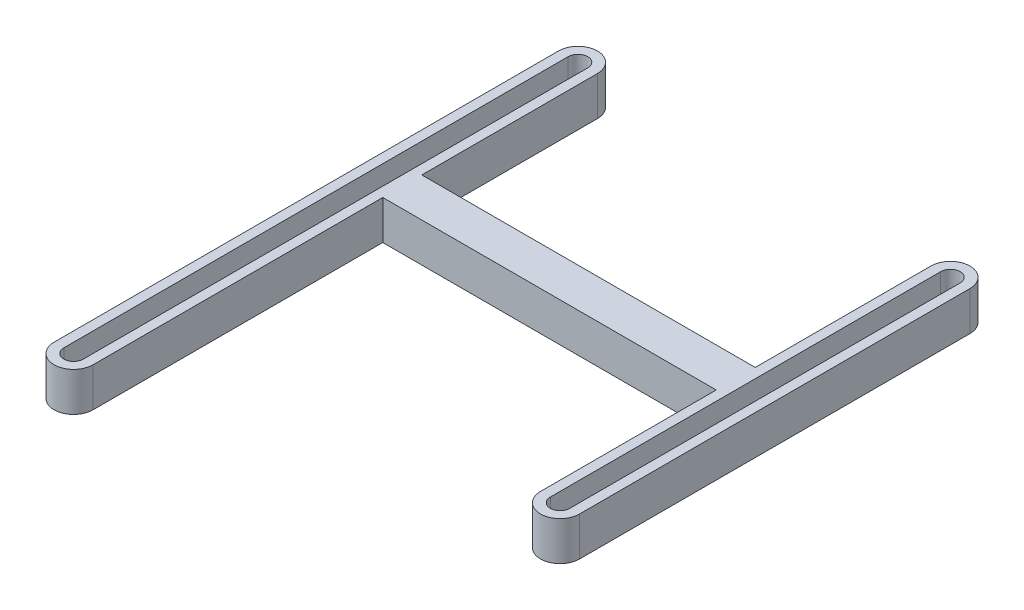
ISO-10303-21;
HEADER;
FILE_DESCRIPTION(('STEP AP214'),'2;1');
FILE_NAME('part.step','',(''),(''),'','','');
FILE_SCHEMA(('AUTOMOTIVE_DESIGN { 1 0 10303 214 1 1 1 1 }'));
ENDSEC;
DATA;
#1=APPLICATION_CONTEXT('core data for automotive mechanical design processes');
#2=APPLICATION_PROTOCOL_DEFINITION('international standard','automotive_design',2000,#1);
#3=PRODUCT_CONTEXT('',#1,'mechanical');
#4=PRODUCT('Part','Part','',(#3));
#5=PRODUCT_RELATED_PRODUCT_CATEGORY('part','',(#4));
#6=PRODUCT_DEFINITION_FORMATION('','',#4);
#7=PRODUCT_DEFINITION_CONTEXT('part definition',#1,'design');
#8=PRODUCT_DEFINITION('design','',#6,#7);
#9=PRODUCT_DEFINITION_SHAPE('','',#8);
#10=(LENGTH_UNIT() NAMED_UNIT(*) SI_UNIT(.MILLI.,.METRE.));
#11=(NAMED_UNIT(*) PLANE_ANGLE_UNIT() SI_UNIT($,.RADIAN.));
#12=(NAMED_UNIT(*) SI_UNIT($,.STERADIAN.) SOLID_ANGLE_UNIT());
#13=UNCERTAINTY_MEASURE_WITH_UNIT(LENGTH_MEASURE(1.E-05),#10,'distance_accuracy_value','');
#14=(GEOMETRIC_REPRESENTATION_CONTEXT(3) GLOBAL_UNCERTAINTY_ASSIGNED_CONTEXT((#13)) GLOBAL_UNIT_ASSIGNED_CONTEXT((#10,
#11,#12)) REPRESENTATION_CONTEXT('',''));
#15=CARTESIAN_POINT('',(0.,0.,0.));
#16=DIRECTION('',(0.,0.,1.));
#17=DIRECTION('',(1.,0.,0.));
#18=AXIS2_PLACEMENT_3D('',#15,#16,#17);
#19=CARTESIAN_POINT('',(110.073911698625,-106.731696712451,0.));
#20=DIRECTION('',(1.,0.,0.));
#21=DIRECTION('',(0.,0.,-1.));
#22=AXIS2_PLACEMENT_3D('',#19,#20,#21);
#23=PLANE('',#22);
#24=DIRECTION('',(0.,0.,1.));
#25=VECTOR('',#24,1.);
#26=CARTESIAN_POINT('',(110.073911698625,-114.731696712451,0.));
#27=LINE('',#26,#25);
#28=CARTESIAN_POINT('',(110.073911698625,-114.731696712451,24.9730881922549));
#29=VERTEX_POINT('',#28);
#30=CARTESIAN_POINT('',(110.073911698625,-114.731696712451,60.9730881922549));
#31=VERTEX_POINT('',#30);
#32=EDGE_CURVE('E232',#29,#31,#27,.T.);
#33=ORIENTED_EDGE('',*,*,#32,.T.);
#34=DIRECTION('',(0.,-1.,0.));
#35=VECTOR('',#34,1.);
#36=CARTESIAN_POINT('',(110.073911698625,-106.731696712451,60.9730881922549));
#37=LINE('',#36,#35);
#38=CARTESIAN_POINT('',(110.073911698625,-106.731696712451,60.9730881922549));
#39=VERTEX_POINT('',#38);
#40=EDGE_CURVE('E11',#39,#31,#37,.T.);
#41=ORIENTED_EDGE('',*,*,#40,.F.);
#42=DIRECTION('',(0.,0.,1.));
#43=VECTOR('',#42,1.);
#44=CARTESIAN_POINT('',(110.073911698625,-106.731696712451,0.));
#45=LINE('',#44,#43);
#46=CARTESIAN_POINT('',(110.073911698625,-106.731696712451,24.9730881922549));
#47=VERTEX_POINT('',#46);
#48=EDGE_CURVE('E422',#47,#39,#45,.T.);
#49=ORIENTED_EDGE('',*,*,#48,.F.);
#50=DIRECTION('',(0.,-1.,0.));
#51=VECTOR('',#50,1.);
#52=CARTESIAN_POINT('',(110.073911698625,-106.731696712451,24.9730881922549));
#53=LINE('',#52,#51);
#54=EDGE_CURVE('E56',#47,#29,#53,.T.);
#55=ORIENTED_EDGE('',*,*,#54,.T.);
#56=EDGE_LOOP('',(#33,#41,#49,#55));
#57=FACE_BOUND('',#56,.T.);
#58=ADVANCED_FACE('F37',(#57),#23,.F.);
#59=CARTESIAN_POINT('',(0.,-106.731696712451,60.9730881922549));
#60=DIRECTION('',(0.,0.,-1.));
#61=DIRECTION('',(-1.,0.,0.));
#62=AXIS2_PLACEMENT_3D('',#59,#60,#61);
#63=PLANE('',#62);
#64=DIRECTION('',(1.,0.,0.));
#65=VECTOR('',#64,1.);
#66=CARTESIAN_POINT('',(0.,-114.731696712451,60.9730881922549));
#67=LINE('',#66,#65);
#68=CARTESIAN_POINT('',(41.7476914478386,-114.731696712451,60.9730881922549));
#69=VERTEX_POINT('',#68);
#70=EDGE_CURVE('E234',#69,#31,#67,.T.);
#71=ORIENTED_EDGE('',*,*,#70,.F.);
#72=DIRECTION('',(0.,-1.,0.));
#73=VECTOR('',#72,1.);
#74=CARTESIAN_POINT('',(41.7476914478386,-106.731696712451,60.9730881922549));
#75=LINE('',#74,#73);
#76=CARTESIAN_POINT('',(41.7476914478386,-106.731696712451,60.9730881922549));
#77=VERTEX_POINT('',#76);
#78=EDGE_CURVE('E47',#77,#69,#75,.T.);
#79=ORIENTED_EDGE('',*,*,#78,.F.);
#80=DIRECTION('',(1.,0.,0.));
#81=VECTOR('',#80,1.);
#82=CARTESIAN_POINT('',(0.,-106.731696712451,60.9730881922549));
#83=LINE('',#82,#81);
#84=EDGE_CURVE('E406',#77,#39,#83,.T.);
#85=ORIENTED_EDGE('',*,*,#84,.T.);
#86=ORIENTED_EDGE('',*,*,#40,.T.);
#87=EDGE_LOOP('',(#71,#79,#85,#86));
#88=FACE_BOUND('',#87,.T.);
#89=ADVANCED_FACE('F324',(#88),#63,.T.);
#90=CARTESIAN_POINT('',(41.7476914478386,-106.731696712451,0.));
#91=DIRECTION('',(1.,0.,0.));
#92=DIRECTION('',(0.,0.,-1.));
#93=AXIS2_PLACEMENT_3D('',#90,#91,#92);
#94=PLANE('',#93);
#95=DIRECTION('',(0.,0.,1.));
#96=VECTOR('',#95,1.);
#97=CARTESIAN_POINT('',(41.7476914478386,-114.731696712451,0.));
#98=LINE('',#97,#96);
#99=CARTESIAN_POINT('',(41.7476914478386,-114.731696712451,24.9730881922549));
#100=VERTEX_POINT('',#99);
#101=EDGE_CURVE('E237',#100,#69,#98,.T.);
#102=ORIENTED_EDGE('',*,*,#101,.F.);
#103=DIRECTION('',(0.,-1.,0.));
#104=VECTOR('',#103,1.);
#105=CARTESIAN_POINT('',(41.7476914478386,-106.731696712451,24.9730881922549));
#106=LINE('',#105,#104);
#107=CARTESIAN_POINT('',(41.7476914478386,-106.731696712451,24.9730881922549));
#108=VERTEX_POINT('',#107);
#109=EDGE_CURVE('E278',#108,#100,#106,.T.);
#110=ORIENTED_EDGE('',*,*,#109,.F.);
#111=DIRECTION('',(0.,0.,1.));
#112=VECTOR('',#111,1.);
#113=CARTESIAN_POINT('',(41.7476914478386,-106.731696712451,0.));
#114=LINE('',#113,#112);
#115=EDGE_CURVE('E402',#108,#77,#114,.T.);
#116=ORIENTED_EDGE('',*,*,#115,.T.);
#117=ORIENTED_EDGE('',*,*,#78,.T.);
#118=EDGE_LOOP('',(#102,#110,#116,#117));
#119=FACE_BOUND('',#118,.T.);
#120=ADVANCED_FACE('F329',(#119),#94,.T.);
#121=CARTESIAN_POINT('',(37.7476914478386,-106.731696712451,24.9730881922549));
#122=DIRECTION('',(0.,-1.,0.));
#123=DIRECTION('',(0.,0.,-1.));
#124=AXIS2_PLACEMENT_3D('',#121,#122,#123);
#125=CYLINDRICAL_SURFACE('',#124,4.);
#126=CARTESIAN_POINT('',(37.7476914478386,-114.731696712451,24.9730881922549));
#127=DIRECTION('',(0.,1.,0.));
#128=DIRECTION('',(0.,0.,1.));
#129=AXIS2_PLACEMENT_3D('',#126,#127,#128);
#130=CIRCLE('',#129,4.);
#131=CARTESIAN_POINT('',(33.7476914478386,-114.731696712451,24.9730881922549));
#132=VERTEX_POINT('',#131);
#133=EDGE_CURVE('E240',#132,#100,#130,.F.);
#134=ORIENTED_EDGE('',*,*,#133,.F.);
#135=DIRECTION('',(0.,-1.,0.));
#136=VECTOR('',#135,1.);
#137=CARTESIAN_POINT('',(33.7476914478386,-106.731696712451,24.9730881922549));
#138=LINE('',#137,#136);
#139=CARTESIAN_POINT('',(33.7476914478386,-106.731696712451,24.9730881922549));
#140=VERTEX_POINT('',#139);
#141=EDGE_CURVE('E276',#140,#132,#138,.T.);
#142=ORIENTED_EDGE('',*,*,#141,.F.);
#143=CARTESIAN_POINT('',(37.7476914478386,-106.731696712451,24.9730881922549));
#144=DIRECTION('',(0.,1.,0.));
#145=DIRECTION('',(0.,0.,1.));
#146=AXIS2_PLACEMENT_3D('',#143,#144,#145);
#147=CIRCLE('',#146,4.);
#148=EDGE_CURVE('E400',#140,#108,#147,.F.);
#149=ORIENTED_EDGE('',*,*,#148,.T.);
#150=ORIENTED_EDGE('',*,*,#109,.T.);
#151=EDGE_LOOP('',(#134,#142,#149,#150));
#152=FACE_BOUND('',#151,.T.);
#153=ADVANCED_FACE('F381',(#152),#125,.T.);
#154=CARTESIAN_POINT('',(33.7476914478386,-106.731696712451,0.));
#155=DIRECTION('',(1.,0.,0.));
#156=DIRECTION('',(0.,0.,-1.));
#157=AXIS2_PLACEMENT_3D('',#154,#155,#156);
#158=PLANE('',#157);
#159=DIRECTION('',(0.,0.,1.));
#160=VECTOR('',#159,1.);
#161=CARTESIAN_POINT('',(33.7476914478386,-114.731696712451,0.));
#162=LINE('',#161,#160);
#163=CARTESIAN_POINT('',(33.7476914478386,-114.731696712451,128.339276478705));
#164=VERTEX_POINT('',#163);
#165=EDGE_CURVE('E243',#132,#164,#162,.T.);
#166=ORIENTED_EDGE('',*,*,#165,.T.);
#167=DIRECTION('',(0.,-1.,0.));
#168=VECTOR('',#167,1.);
#169=CARTESIAN_POINT('',(33.7476914478386,-106.731696712451,128.339276478705));
#170=LINE('',#169,#168);
#171=CARTESIAN_POINT('',(33.7476914478386,-106.731696712451,128.339276478705));
#172=VERTEX_POINT('',#171);
#173=EDGE_CURVE('E273',#172,#164,#170,.T.);
#174=ORIENTED_EDGE('',*,*,#173,.F.);
#175=DIRECTION('',(0.,0.,1.));
#176=VECTOR('',#175,1.);
#177=CARTESIAN_POINT('',(33.7476914478386,-106.731696712451,0.));
#178=LINE('',#177,#176);
#179=EDGE_CURVE('E401',#140,#172,#178,.T.);
#180=ORIENTED_EDGE('',*,*,#179,.F.);
#181=ORIENTED_EDGE('',*,*,#141,.T.);
#182=EDGE_LOOP('',(#166,#174,#180,#181));
#183=FACE_BOUND('',#182,.T.);
#184=ADVANCED_FACE('F377',(#183),#158,.F.);
#185=CARTESIAN_POINT('',(37.7476914478386,-106.731696712451,128.339276478705));
#186=DIRECTION('',(0.,-1.,0.));
#187=DIRECTION('',(0.,0.,-1.));
#188=AXIS2_PLACEMENT_3D('',#185,#186,#187);
#189=CYLINDRICAL_SURFACE('',#188,4.);
#190=CARTESIAN_POINT('',(37.7476914478386,-114.731696712451,128.339276478705));
#191=DIRECTION('',(0.,1.,0.));
#192=DIRECTION('',(0.,0.,1.));
#193=AXIS2_PLACEMENT_3D('',#190,#191,#192);
#194=CIRCLE('',#193,4.);
#195=CARTESIAN_POINT('',(41.7476914478386,-114.731696712451,128.339276478705));
#196=VERTEX_POINT('',#195);
#197=EDGE_CURVE('E245',#164,#196,#194,.T.);
#198=ORIENTED_EDGE('',*,*,#197,.T.);
#199=DIRECTION('',(0.,-1.,0.));
#200=VECTOR('',#199,1.);
#201=CARTESIAN_POINT('',(41.7476914478386,-106.731696712451,128.339276478705));
#202=LINE('',#201,#200);
#203=CARTESIAN_POINT('',(41.7476914478386,-106.731696712451,128.339276478705));
#204=VERTEX_POINT('',#203);
#205=EDGE_CURVE('E271',#204,#196,#202,.T.);
#206=ORIENTED_EDGE('',*,*,#205,.F.);
#207=CARTESIAN_POINT('',(37.7476914478386,-106.731696712451,128.339276478705));
#208=DIRECTION('',(0.,1.,0.));
#209=DIRECTION('',(0.,0.,1.));
#210=AXIS2_PLACEMENT_3D('',#207,#208,#209);
#211=CIRCLE('',#210,4.);
#212=EDGE_CURVE('E404',#172,#204,#211,.T.);
#213=ORIENTED_EDGE('',*,*,#212,.F.);
#214=ORIENTED_EDGE('',*,*,#173,.T.);
#215=EDGE_LOOP('',(#198,#206,#213,#214));
#216=FACE_BOUND('',#215,.T.);
#217=ADVANCED_FACE('F373',(#216),#189,.T.);
#218=CARTESIAN_POINT('',(41.7476914478386,-106.731696712451,0.));
#219=DIRECTION('',(1.,0.,0.));
#220=DIRECTION('',(0.,0.,-1.));
#221=AXIS2_PLACEMENT_3D('',#218,#219,#220);
#222=PLANE('',#221);
#223=DIRECTION('',(0.,0.,1.));
#224=VECTOR('',#223,1.);
#225=CARTESIAN_POINT('',(41.7476914478386,-114.731696712451,0.));
#226=LINE('',#225,#224);
#227=CARTESIAN_POINT('',(41.7476914478386,-114.731696712451,68.9730881922549));
#228=VERTEX_POINT('',#227);
#229=EDGE_CURVE('E248',#228,#196,#226,.T.);
#230=ORIENTED_EDGE('',*,*,#229,.F.);
#231=DIRECTION('',(0.,-1.,0.));
#232=VECTOR('',#231,1.);
#233=CARTESIAN_POINT('',(41.7476914478386,-106.731696712451,68.9730881922549));
#234=LINE('',#233,#232);
#235=CARTESIAN_POINT('',(41.7476914478386,-106.731696712451,68.9730881922549));
#236=VERTEX_POINT('',#235);
#237=EDGE_CURVE('E269',#236,#228,#234,.T.);
#238=ORIENTED_EDGE('',*,*,#237,.F.);
#239=DIRECTION('',(0.,0.,1.));
#240=VECTOR('',#239,1.);
#241=CARTESIAN_POINT('',(41.7476914478386,-106.731696712451,0.));
#242=LINE('',#241,#240);
#243=EDGE_CURVE('E411',#236,#204,#242,.T.);
#244=ORIENTED_EDGE('',*,*,#243,.T.);
#245=ORIENTED_EDGE('',*,*,#205,.T.);
#246=EDGE_LOOP('',(#230,#238,#244,#245));
#247=FACE_BOUND('',#246,.T.);
#248=ADVANCED_FACE('F369',(#247),#222,.T.);
#249=CARTESIAN_POINT('',(0.,-106.731696712451,68.9730881922549));
#250=DIRECTION('',(0.,0.,-1.));
#251=DIRECTION('',(-1.,0.,0.));
#252=AXIS2_PLACEMENT_3D('',#249,#250,#251);
#253=PLANE('',#252);
#254=DIRECTION('',(1.,0.,0.));
#255=VECTOR('',#254,1.);
#256=CARTESIAN_POINT('',(0.,-114.731696712451,68.9730881922549));
#257=LINE('',#256,#255);
#258=CARTESIAN_POINT('',(110.073911698625,-114.731696712451,68.9730881922549));
#259=VERTEX_POINT('',#258);
#260=EDGE_CURVE('E251',#228,#259,#257,.T.);
#261=ORIENTED_EDGE('',*,*,#260,.T.);
#262=DIRECTION('',(0.,-1.,0.));
#263=VECTOR('',#262,1.);
#264=CARTESIAN_POINT('',(110.073911698625,-106.731696712451,68.9730881922549));
#265=LINE('',#264,#263);
#266=CARTESIAN_POINT('',(110.073911698625,-106.731696712451,68.9730881922549));
#267=VERTEX_POINT('',#266);
#268=EDGE_CURVE('E266',#267,#259,#265,.T.);
#269=ORIENTED_EDGE('',*,*,#268,.F.);
#270=DIRECTION('',(1.,0.,0.));
#271=VECTOR('',#270,1.);
#272=CARTESIAN_POINT('',(0.,-106.731696712451,68.9730881922549));
#273=LINE('',#272,#271);
#274=EDGE_CURVE('E414',#236,#267,#273,.T.);
#275=ORIENTED_EDGE('',*,*,#274,.F.);
#276=ORIENTED_EDGE('',*,*,#237,.T.);
#277=EDGE_LOOP('',(#261,#269,#275,#276));
#278=FACE_BOUND('',#277,.T.);
#279=ADVANCED_FACE('F365',(#278),#253,.F.);
#280=CARTESIAN_POINT('',(110.073911698625,-106.731696712451,0.));
#281=DIRECTION('',(1.,0.,0.));
#282=DIRECTION('',(0.,0.,-1.));
#283=AXIS2_PLACEMENT_3D('',#280,#281,#282);
#284=PLANE('',#283);
#285=DIRECTION('',(0.,0.,1.));
#286=VECTOR('',#285,1.);
#287=CARTESIAN_POINT('',(110.073911698625,-114.731696712451,0.));
#288=LINE('',#287,#286);
#289=CARTESIAN_POINT('',(110.073911698625,-114.731696712451,104.973088192255));
#290=VERTEX_POINT('',#289);
#291=EDGE_CURVE('E253',#259,#290,#288,.T.);
#292=ORIENTED_EDGE('',*,*,#291,.T.);
#293=DIRECTION('',(0.,-1.,0.));
#294=VECTOR('',#293,1.);
#295=CARTESIAN_POINT('',(110.073911698625,-106.731696712451,104.973088192255));
#296=LINE('',#295,#294);
#297=CARTESIAN_POINT('',(110.073911698625,-106.731696712451,104.973088192255));
#298=VERTEX_POINT('',#297);
#299=EDGE_CURVE('E200',#298,#290,#296,.T.);
#300=ORIENTED_EDGE('',*,*,#299,.F.);
#301=DIRECTION('',(0.,0.,1.));
#302=VECTOR('',#301,1.);
#303=CARTESIAN_POINT('',(110.073911698625,-106.731696712451,0.));
#304=LINE('',#303,#302);
#305=EDGE_CURVE('E188',#267,#298,#304,.T.);
#306=ORIENTED_EDGE('',*,*,#305,.F.);
#307=ORIENTED_EDGE('',*,*,#268,.T.);
#308=EDGE_LOOP('',(#292,#300,#306,#307));
#309=FACE_BOUND('',#308,.T.);
#310=ADVANCED_FACE('F362',(#309),#284,.F.);
#311=CARTESIAN_POINT('',(114.073911698625,-106.731696712451,104.973088192255));
#312=DIRECTION('',(0.,-1.,0.));
#313=DIRECTION('',(0.,0.,-1.));
#314=AXIS2_PLACEMENT_3D('',#311,#312,#313);
#315=CYLINDRICAL_SURFACE('',#314,4.);
#316=CARTESIAN_POINT('',(114.073911698625,-114.731696712451,104.973088192255));
#317=DIRECTION('',(0.,1.,0.));
#318=DIRECTION('',(0.,0.,1.));
#319=AXIS2_PLACEMENT_3D('',#316,#317,#318);
#320=CIRCLE('',#319,4.);
#321=CARTESIAN_POINT('',(118.073911698625,-114.731696712451,104.973088192255));
#322=VERTEX_POINT('',#321);
#323=EDGE_CURVE('E197',#290,#322,#320,.T.);
#324=ORIENTED_EDGE('',*,*,#323,.T.);
#325=DIRECTION('',(0.,-1.,0.));
#326=VECTOR('',#325,1.);
#327=CARTESIAN_POINT('',(118.073911698625,-106.731696712451,104.973088192255));
#328=LINE('',#327,#326);
#329=CARTESIAN_POINT('',(118.073911698625,-106.731696712451,104.973088192255));
#330=VERTEX_POINT('',#329);
#331=EDGE_CURVE('E194',#330,#322,#328,.T.);
#332=ORIENTED_EDGE('',*,*,#331,.F.);
#333=CARTESIAN_POINT('',(114.073911698625,-106.731696712451,104.973088192255));
#334=DIRECTION('',(0.,1.,0.));
#335=DIRECTION('',(0.,0.,1.));
#336=AXIS2_PLACEMENT_3D('',#333,#334,#335);
#337=CIRCLE('',#336,4.);
#338=EDGE_CURVE('E181',#298,#330,#337,.T.);
#339=ORIENTED_EDGE('',*,*,#338,.F.);
#340=ORIENTED_EDGE('',*,*,#299,.T.);
#341=EDGE_LOOP('',(#324,#332,#339,#340));
#342=FACE_BOUND('',#341,.T.);
#343=ADVANCED_FACE('F195',(#342),#315,.T.);
#344=CARTESIAN_POINT('',(118.073911698625,-106.731696712451,0.));
#345=DIRECTION('',(1.,0.,0.));
#346=DIRECTION('',(0.,0.,-1.));
#347=AXIS2_PLACEMENT_3D('',#344,#345,#346);
#348=PLANE('',#347);
#349=DIRECTION('',(0.,0.,1.));
#350=VECTOR('',#349,1.);
#351=CARTESIAN_POINT('',(118.073911698625,-114.731696712451,0.));
#352=LINE('',#351,#350);
#353=CARTESIAN_POINT('',(118.073911698625,-114.731696712451,24.9730881922549));
#354=VERTEX_POINT('',#353);
#355=EDGE_CURVE('E256',#354,#322,#352,.T.);
#356=ORIENTED_EDGE('',*,*,#355,.F.);
#357=DIRECTION('',(0.,-1.,0.));
#358=VECTOR('',#357,1.);
#359=CARTESIAN_POINT('',(118.073911698625,-106.731696712451,24.9730881922549));
#360=LINE('',#359,#358);
#361=CARTESIAN_POINT('',(118.073911698625,-106.731696712451,24.9730881922549));
#362=VERTEX_POINT('',#361);
#363=EDGE_CURVE('E117',#362,#354,#360,.T.);
#364=ORIENTED_EDGE('',*,*,#363,.F.);
#365=DIRECTION('',(0.,0.,1.));
#366=VECTOR('',#365,1.);
#367=CARTESIAN_POINT('',(118.073911698625,-106.731696712451,0.));
#368=LINE('',#367,#366);
#369=EDGE_CURVE('E186',#362,#330,#368,.T.);
#370=ORIENTED_EDGE('',*,*,#369,.T.);
#371=ORIENTED_EDGE('',*,*,#331,.T.);
#372=EDGE_LOOP('',(#356,#364,#370,#371));
#373=FACE_BOUND('',#372,.T.);
#374=ADVANCED_FACE('F202',(#373),#348,.T.);
#375=CARTESIAN_POINT('',(112.073911698625,-106.731696712451,0.));
#376=DIRECTION('',(1.,0.,0.));
#377=DIRECTION('',(0.,0.,-1.));
#378=AXIS2_PLACEMENT_3D('',#375,#376,#377);
#379=PLANE('',#378);
#380=DIRECTION('',(0.,0.,1.));
#381=VECTOR('',#380,1.);
#382=CARTESIAN_POINT('',(112.073911698625,-114.731696712451,0.));
#383=LINE('',#382,#381);
#384=CARTESIAN_POINT('',(112.073911698625,-114.731696712451,24.9730881922549));
#385=VERTEX_POINT('',#384);
#386=CARTESIAN_POINT('',(112.073911698625,-114.731696712451,104.973088192255));
#387=VERTEX_POINT('',#386);
#388=EDGE_CURVE('E220',#385,#387,#383,.T.);
#389=ORIENTED_EDGE('',*,*,#388,.F.);
#390=DIRECTION('',(0.,-1.,0.));
#391=VECTOR('',#390,1.);
#392=CARTESIAN_POINT('',(112.073911698625,-106.731696712451,24.9730881922549));
#393=LINE('',#392,#391);
#394=CARTESIAN_POINT('',(112.073911698625,-106.731696712451,24.9730881922549));
#395=VERTEX_POINT('',#394);
#396=EDGE_CURVE('E263',#395,#385,#393,.T.);
#397=ORIENTED_EDGE('',*,*,#396,.F.);
#398=DIRECTION('',(0.,0.,1.));
#399=VECTOR('',#398,1.);
#400=CARTESIAN_POINT('',(112.073911698625,-106.731696712451,0.));
#401=LINE('',#400,#399);
#402=CARTESIAN_POINT('',(112.073911698625,-106.731696712451,104.973088192255));
#403=VERTEX_POINT('',#402);
#404=EDGE_CURVE('E434',#395,#403,#401,.T.);
#405=ORIENTED_EDGE('',*,*,#404,.T.);
#406=DIRECTION('',(0.,-1.,0.));
#407=VECTOR('',#406,1.);
#408=CARTESIAN_POINT('',(112.073911698625,-106.731696712451,104.973088192255));
#409=LINE('',#408,#407);
#410=EDGE_CURVE('E281',#403,#387,#409,.T.);
#411=ORIENTED_EDGE('',*,*,#410,.T.);
#412=EDGE_LOOP('',(#389,#397,#405,#411));
#413=FACE_BOUND('',#412,.T.);
#414=ADVANCED_FACE('F341',(#413),#379,.T.);
#415=CARTESIAN_POINT('',(114.073911698625,-106.731696712451,24.9730881922549));
#416=DIRECTION('',(0.,-1.,0.));
#417=DIRECTION('',(0.,0.,-1.));
#418=AXIS2_PLACEMENT_3D('',#415,#416,#417);
#419=CYLINDRICAL_SURFACE('',#418,2.);
#420=CARTESIAN_POINT('',(114.073911698625,-114.731696712451,24.9730881922549));
#421=DIRECTION('',(0.,1.,0.));
#422=DIRECTION('',(0.,0.,1.));
#423=AXIS2_PLACEMENT_3D('',#420,#421,#422);
#424=CIRCLE('',#423,2.);
#425=CARTESIAN_POINT('',(116.073911698625,-114.731696712451,24.9730881922549));
#426=VERTEX_POINT('',#425);
#427=EDGE_CURVE('E223',#385,#426,#424,.F.);
#428=ORIENTED_EDGE('',*,*,#427,.T.);
#429=DIRECTION('',(0.,-1.,0.));
#430=VECTOR('',#429,1.);
#431=CARTESIAN_POINT('',(116.073911698625,-106.731696712451,24.9730881922549));
#432=LINE('',#431,#430);
#433=CARTESIAN_POINT('',(116.073911698625,-106.731696712451,24.9730881922549));
#434=VERTEX_POINT('',#433);
#435=EDGE_CURVE('E285',#434,#426,#432,.T.);
#436=ORIENTED_EDGE('',*,*,#435,.F.);
#437=CARTESIAN_POINT('',(114.073911698625,-106.731696712451,24.9730881922549));
#438=DIRECTION('',(0.,1.,0.));
#439=DIRECTION('',(0.,0.,1.));
#440=AXIS2_PLACEMENT_3D('',#437,#438,#439);
#441=CIRCLE('',#440,2.);
#442=EDGE_CURVE('E431',#395,#434,#441,.F.);
#443=ORIENTED_EDGE('',*,*,#442,.F.);
#444=ORIENTED_EDGE('',*,*,#396,.T.);
#445=EDGE_LOOP('',(#428,#436,#443,#444));
#446=FACE_BOUND('',#445,.T.);
#447=ADVANCED_FACE('F337',(#446),#419,.F.);
#448=CARTESIAN_POINT('',(116.073911698625,-106.731696712451,0.));
#449=DIRECTION('',(1.,0.,0.));
#450=DIRECTION('',(0.,0.,-1.));
#451=AXIS2_PLACEMENT_3D('',#448,#449,#450);
#452=PLANE('',#451);
#453=DIRECTION('',(0.,0.,1.));
#454=VECTOR('',#453,1.);
#455=CARTESIAN_POINT('',(116.073911698625,-114.731696712451,0.));
#456=LINE('',#455,#454);
#457=CARTESIAN_POINT('',(116.073911698625,-114.731696712451,104.973088192255));
#458=VERTEX_POINT('',#457);
#459=EDGE_CURVE('E226',#426,#458,#456,.T.);
#460=ORIENTED_EDGE('',*,*,#459,.T.);
#461=DIRECTION('',(0.,-1.,0.));
#462=VECTOR('',#461,1.);
#463=CARTESIAN_POINT('',(116.073911698625,-106.731696712451,104.973088192255));
#464=LINE('',#463,#462);
#465=CARTESIAN_POINT('',(116.073911698625,-106.731696712451,104.973088192255));
#466=VERTEX_POINT('',#465);
#467=EDGE_CURVE('E283',#466,#458,#464,.T.);
#468=ORIENTED_EDGE('',*,*,#467,.F.);
#469=DIRECTION('',(0.,0.,1.));
#470=VECTOR('',#469,1.);
#471=CARTESIAN_POINT('',(116.073911698625,-106.731696712451,0.));
#472=LINE('',#471,#470);
#473=EDGE_CURVE('E429',#434,#466,#472,.T.);
#474=ORIENTED_EDGE('',*,*,#473,.F.);
#475=ORIENTED_EDGE('',*,*,#435,.T.);
#476=EDGE_LOOP('',(#460,#468,#474,#475));
#477=FACE_BOUND('',#476,.T.);
#478=ADVANCED_FACE('F334',(#477),#452,.F.);
#479=CARTESIAN_POINT('',(35.7476914478386,-106.731696712451,0.));
#480=DIRECTION('',(1.,0.,0.));
#481=DIRECTION('',(0.,0.,-1.));
#482=AXIS2_PLACEMENT_3D('',#479,#480,#481);
#483=PLANE('',#482);
#484=DIRECTION('',(0.,0.,1.));
#485=VECTOR('',#484,1.);
#486=CARTESIAN_POINT('',(35.7476914478386,-114.731696712451,0.));
#487=LINE('',#486,#485);
#488=CARTESIAN_POINT('',(35.7476914478386,-114.731696712451,24.9730881922549));
#489=VERTEX_POINT('',#488);
#490=CARTESIAN_POINT('',(35.7476914478386,-114.731696712451,128.339276478705));
#491=VERTEX_POINT('',#490);
#492=EDGE_CURVE('E209',#489,#491,#487,.T.);
#493=ORIENTED_EDGE('',*,*,#492,.F.);
#494=DIRECTION('',(0.,-1.,0.));
#495=VECTOR('',#494,1.);
#496=CARTESIAN_POINT('',(35.7476914478386,-106.731696712451,24.9730881922549));
#497=LINE('',#496,#495);
#498=CARTESIAN_POINT('',(35.7476914478386,-106.731696712451,24.9730881922549));
#499=VERTEX_POINT('',#498);
#500=EDGE_CURVE('E41',#499,#489,#497,.T.);
#501=ORIENTED_EDGE('',*,*,#500,.F.);
#502=DIRECTION('',(0.,0.,1.));
#503=VECTOR('',#502,1.);
#504=CARTESIAN_POINT('',(35.7476914478386,-106.731696712451,0.));
#505=LINE('',#504,#503);
#506=CARTESIAN_POINT('',(35.7476914478386,-106.731696712451,128.339276478705));
#507=VERTEX_POINT('',#506);
#508=EDGE_CURVE('E261',#499,#507,#505,.T.);
#509=ORIENTED_EDGE('',*,*,#508,.T.);
#510=DIRECTION('',(0.,-1.,0.));
#511=VECTOR('',#510,1.);
#512=CARTESIAN_POINT('',(35.7476914478386,-106.731696712451,128.339276478705));
#513=LINE('',#512,#511);
#514=EDGE_CURVE('E205',#507,#491,#513,.T.);
#515=ORIENTED_EDGE('',*,*,#514,.T.);
#516=EDGE_LOOP('',(#493,#501,#509,#515));
#517=FACE_BOUND('',#516,.T.);
#518=ADVANCED_FACE('F39',(#517),#483,.T.);
#519=CARTESIAN_POINT('',(37.7476914478386,-106.731696712451,24.9730881922549));
#520=DIRECTION('',(0.,-1.,0.));
#521=DIRECTION('',(0.,0.,-1.));
#522=AXIS2_PLACEMENT_3D('',#519,#520,#521);
#523=CYLINDRICAL_SURFACE('',#522,2.);
#524=CARTESIAN_POINT('',(37.7476914478386,-114.731696712451,24.9730881922549));
#525=DIRECTION('',(0.,1.,0.));
#526=DIRECTION('',(0.,0.,1.));
#527=AXIS2_PLACEMENT_3D('',#524,#525,#526);
#528=CIRCLE('',#527,2.);
#529=CARTESIAN_POINT('',(39.7476914478386,-114.731696712451,24.9730881922549));
#530=VERTEX_POINT('',#529);
#531=EDGE_CURVE('E212',#489,#530,#528,.F.);
#532=ORIENTED_EDGE('',*,*,#531,.T.);
#533=DIRECTION('',(0.,-1.,0.));
#534=VECTOR('',#533,1.);
#535=CARTESIAN_POINT('',(39.7476914478386,-106.731696712451,24.9730881922549));
#536=LINE('',#535,#534);
#537=CARTESIAN_POINT('',(39.7476914478386,-106.731696712451,24.9730881922549));
#538=VERTEX_POINT('',#537);
#539=EDGE_CURVE('E291',#538,#530,#536,.T.);
#540=ORIENTED_EDGE('',*,*,#539,.F.);
#541=CARTESIAN_POINT('',(37.7476914478386,-106.731696712451,24.9730881922549));
#542=DIRECTION('',(0.,1.,0.));
#543=DIRECTION('',(0.,0.,1.));
#544=AXIS2_PLACEMENT_3D('',#541,#542,#543);
#545=CIRCLE('',#544,2.);
#546=EDGE_CURVE('E300',#499,#538,#545,.F.);
#547=ORIENTED_EDGE('',*,*,#546,.F.);
#548=ORIENTED_EDGE('',*,*,#500,.T.);
#549=EDGE_LOOP('',(#532,#540,#547,#548));
#550=FACE_BOUND('',#549,.T.);
#551=ADVANCED_FACE('F299',(#550),#523,.F.);
#552=CARTESIAN_POINT('',(39.7476914478386,-106.731696712451,0.));
#553=DIRECTION('',(1.,0.,0.));
#554=DIRECTION('',(0.,0.,-1.));
#555=AXIS2_PLACEMENT_3D('',#552,#553,#554);
#556=PLANE('',#555);
#557=DIRECTION('',(0.,0.,1.));
#558=VECTOR('',#557,1.);
#559=CARTESIAN_POINT('',(39.7476914478386,-114.731696712451,0.));
#560=LINE('',#559,#558);
#561=CARTESIAN_POINT('',(39.7476914478386,-114.731696712451,128.339276478705));
#562=VERTEX_POINT('',#561);
#563=EDGE_CURVE('E214',#530,#562,#560,.T.);
#564=ORIENTED_EDGE('',*,*,#563,.T.);
#565=DIRECTION('',(0.,-1.,0.));
#566=VECTOR('',#565,1.);
#567=CARTESIAN_POINT('',(39.7476914478386,-106.731696712451,128.339276478705));
#568=LINE('',#567,#566);
#569=CARTESIAN_POINT('',(39.7476914478386,-106.731696712451,128.339276478705));
#570=VERTEX_POINT('',#569);
#571=EDGE_CURVE('E290',#570,#562,#568,.T.);
#572=ORIENTED_EDGE('',*,*,#571,.F.);
#573=DIRECTION('',(0.,0.,1.));
#574=VECTOR('',#573,1.);
#575=CARTESIAN_POINT('',(39.7476914478386,-106.731696712451,0.));
#576=LINE('',#575,#574);
#577=EDGE_CURVE('E438',#538,#570,#576,.T.);
#578=ORIENTED_EDGE('',*,*,#577,.F.);
#579=ORIENTED_EDGE('',*,*,#539,.T.);
#580=EDGE_LOOP('',(#564,#572,#578,#579));
#581=FACE_BOUND('',#580,.T.);
#582=ADVANCED_FACE('F312',(#581),#556,.F.);
#583=CARTESIAN_POINT('',(114.073911698625,-106.731696712451,104.973088192255));
#584=DIRECTION('',(0.,-1.,0.));
#585=DIRECTION('',(0.,0.,-1.));
#586=AXIS2_PLACEMENT_3D('',#583,#584,#585);
#587=CYLINDRICAL_SURFACE('',#586,2.);
#588=CARTESIAN_POINT('',(114.073911698625,-114.731696712451,104.973088192255));
#589=DIRECTION('',(0.,1.,0.));
#590=DIRECTION('',(0.,0.,1.));
#591=AXIS2_PLACEMENT_3D('',#588,#589,#590);
#592=CIRCLE('',#591,2.);
#593=EDGE_CURVE('E229',#387,#458,#592,.T.);
#594=ORIENTED_EDGE('',*,*,#593,.F.);
#595=ORIENTED_EDGE('',*,*,#410,.F.);
#596=CARTESIAN_POINT('',(114.073911698625,-106.731696712451,104.973088192255));
#597=DIRECTION('',(0.,1.,0.));
#598=DIRECTION('',(0.,0.,1.));
#599=AXIS2_PLACEMENT_3D('',#596,#597,#598);
#600=CIRCLE('',#599,2.);
#601=EDGE_CURVE('E424',#403,#466,#600,.T.);
#602=ORIENTED_EDGE('',*,*,#601,.T.);
#603=ORIENTED_EDGE('',*,*,#467,.T.);
#604=EDGE_LOOP('',(#594,#595,#602,#603));
#605=FACE_BOUND('',#604,.T.);
#606=ADVANCED_FACE('F314',(#605),#587,.F.);
#607=CARTESIAN_POINT('',(37.7476914478386,-106.731696712451,128.339276478705));
#608=DIRECTION('',(0.,-1.,0.));
#609=DIRECTION('',(0.,0.,-1.));
#610=AXIS2_PLACEMENT_3D('',#607,#608,#609);
#611=CYLINDRICAL_SURFACE('',#610,2.);
#612=CARTESIAN_POINT('',(37.7476914478386,-114.731696712451,128.339276478705));
#613=DIRECTION('',(0.,1.,0.));
#614=DIRECTION('',(0.,0.,1.));
#615=AXIS2_PLACEMENT_3D('',#612,#613,#614);
#616=CIRCLE('',#615,2.);
#617=EDGE_CURVE('E217',#491,#562,#616,.T.);
#618=ORIENTED_EDGE('',*,*,#617,.F.);
#619=ORIENTED_EDGE('',*,*,#514,.F.);
#620=CARTESIAN_POINT('',(37.7476914478386,-106.731696712451,128.339276478705));
#621=DIRECTION('',(0.,1.,0.));
#622=DIRECTION('',(0.,0.,1.));
#623=AXIS2_PLACEMENT_3D('',#620,#621,#622);
#624=CIRCLE('',#623,2.);
#625=EDGE_CURVE('E310',#507,#570,#624,.T.);
#626=ORIENTED_EDGE('',*,*,#625,.T.);
#627=ORIENTED_EDGE('',*,*,#571,.T.);
#628=EDGE_LOOP('',(#618,#619,#626,#627));
#629=FACE_BOUND('',#628,.T.);
#630=ADVANCED_FACE('F309',(#629),#611,.F.);
#631=CARTESIAN_POINT('',(114.073911698625,-106.731696712451,24.9730881922549));
#632=DIRECTION('',(0.,-1.,0.));
#633=DIRECTION('',(0.,0.,-1.));
#634=AXIS2_PLACEMENT_3D('',#631,#632,#633);
#635=CYLINDRICAL_SURFACE('',#634,4.);
#636=CARTESIAN_POINT('',(114.073911698625,-114.731696712451,24.9730881922549));
#637=DIRECTION('',(0.,1.,0.));
#638=DIRECTION('',(0.,0.,1.));
#639=AXIS2_PLACEMENT_3D('',#636,#637,#638);
#640=CIRCLE('',#639,4.);
#641=EDGE_CURVE('E258',#29,#354,#640,.F.);
#642=ORIENTED_EDGE('',*,*,#641,.F.);
#643=ORIENTED_EDGE('',*,*,#54,.F.);
#644=CARTESIAN_POINT('',(114.073911698625,-106.731696712451,24.9730881922549));
#645=DIRECTION('',(0.,1.,0.));
#646=DIRECTION('',(0.,0.,1.));
#647=AXIS2_PLACEMENT_3D('',#644,#645,#646);
#648=CIRCLE('',#647,4.);
#649=EDGE_CURVE('E203',#47,#362,#648,.F.);
#650=ORIENTED_EDGE('',*,*,#649,.T.);
#651=ORIENTED_EDGE('',*,*,#363,.T.);
#652=EDGE_LOOP('',(#642,#643,#650,#651));
#653=FACE_BOUND('',#652,.T.);
#654=ADVANCED_FACE('F346',(#653),#635,.T.);
#655=CARTESIAN_POINT('',(0.,-106.731696712451,0.));
#656=DIRECTION('',(0.,1.,0.));
#657=DIRECTION('',(0.,0.,1.));
#658=AXIS2_PLACEMENT_3D('',#655,#656,#657);
#659=PLANE('',#658);
#660=ORIENTED_EDGE('',*,*,#508,.F.);
#661=ORIENTED_EDGE('',*,*,#546,.T.);
#662=ORIENTED_EDGE('',*,*,#577,.T.);
#663=ORIENTED_EDGE('',*,*,#625,.F.);
#664=EDGE_LOOP('',(#660,#661,#662,#663));
#665=FACE_BOUND('',#664,.T.);
#666=ORIENTED_EDGE('',*,*,#404,.F.);
#667=ORIENTED_EDGE('',*,*,#442,.T.);
#668=ORIENTED_EDGE('',*,*,#473,.T.);
#669=ORIENTED_EDGE('',*,*,#601,.F.);
#670=EDGE_LOOP('',(#666,#667,#668,#669));
#671=FACE_BOUND('',#670,.T.);
#672=ORIENTED_EDGE('',*,*,#48,.T.);
#673=ORIENTED_EDGE('',*,*,#84,.F.);
#674=ORIENTED_EDGE('',*,*,#115,.F.);
#675=ORIENTED_EDGE('',*,*,#148,.F.);
#676=ORIENTED_EDGE('',*,*,#179,.T.);
#677=ORIENTED_EDGE('',*,*,#212,.T.);
#678=ORIENTED_EDGE('',*,*,#243,.F.);
#679=ORIENTED_EDGE('',*,*,#274,.T.);
#680=ORIENTED_EDGE('',*,*,#305,.T.);
#681=ORIENTED_EDGE('',*,*,#338,.T.);
#682=ORIENTED_EDGE('',*,*,#369,.F.);
#683=ORIENTED_EDGE('',*,*,#649,.F.);
#684=EDGE_LOOP('',(#672,#673,#674,#675,#676,#677,#678,#679,#680,#681,#682,#683));
#685=FACE_BOUND('',#684,.T.);
#686=ADVANCED_FACE('F183',(#665,#671,#685),#659,.T.);
#687=CARTESIAN_POINT('',(0.,-114.731696712451,0.));
#688=DIRECTION('',(0.,1.,0.));
#689=DIRECTION('',(0.,0.,1.));
#690=AXIS2_PLACEMENT_3D('',#687,#688,#689);
#691=PLANE('',#690);
#692=ORIENTED_EDGE('',*,*,#492,.T.);
#693=ORIENTED_EDGE('',*,*,#617,.T.);
#694=ORIENTED_EDGE('',*,*,#563,.F.);
#695=ORIENTED_EDGE('',*,*,#531,.F.);
#696=EDGE_LOOP('',(#692,#693,#694,#695));
#697=FACE_BOUND('',#696,.T.);
#698=ORIENTED_EDGE('',*,*,#388,.T.);
#699=ORIENTED_EDGE('',*,*,#593,.T.);
#700=ORIENTED_EDGE('',*,*,#459,.F.);
#701=ORIENTED_EDGE('',*,*,#427,.F.);
#702=EDGE_LOOP('',(#698,#699,#700,#701));
#703=FACE_BOUND('',#702,.T.);
#704=ORIENTED_EDGE('',*,*,#32,.F.);
#705=ORIENTED_EDGE('',*,*,#641,.T.);
#706=ORIENTED_EDGE('',*,*,#355,.T.);
#707=ORIENTED_EDGE('',*,*,#323,.F.);
#708=ORIENTED_EDGE('',*,*,#291,.F.);
#709=ORIENTED_EDGE('',*,*,#260,.F.);
#710=ORIENTED_EDGE('',*,*,#229,.T.);
#711=ORIENTED_EDGE('',*,*,#197,.F.);
#712=ORIENTED_EDGE('',*,*,#165,.F.);
#713=ORIENTED_EDGE('',*,*,#133,.T.);
#714=ORIENTED_EDGE('',*,*,#101,.T.);
#715=ORIENTED_EDGE('',*,*,#70,.T.);
#716=EDGE_LOOP('',(#704,#705,#706,#707,#708,#709,#710,#711,#712,#713,#714,#715));
#717=FACE_BOUND('',#716,.T.);
#718=ADVANCED_FACE('F303',(#697,#703,#717),#691,.F.);
#719=CLOSED_SHELL('',(#58,#89,#120,#153,#184,#217,#248,#279,#310,#343,#374,#414,#447,#478,#518,
#551,#582,#606,#630,#654,#686,#718));
#720=MANIFOLD_SOLID_BREP('B2',#719);
#721=ADVANCED_BREP_SHAPE_REPRESENTATION('',(#18,#720),#14);
#722=SHAPE_DEFINITION_REPRESENTATION(#9,#721);
ENDSEC;
END-ISO-10303-21;
